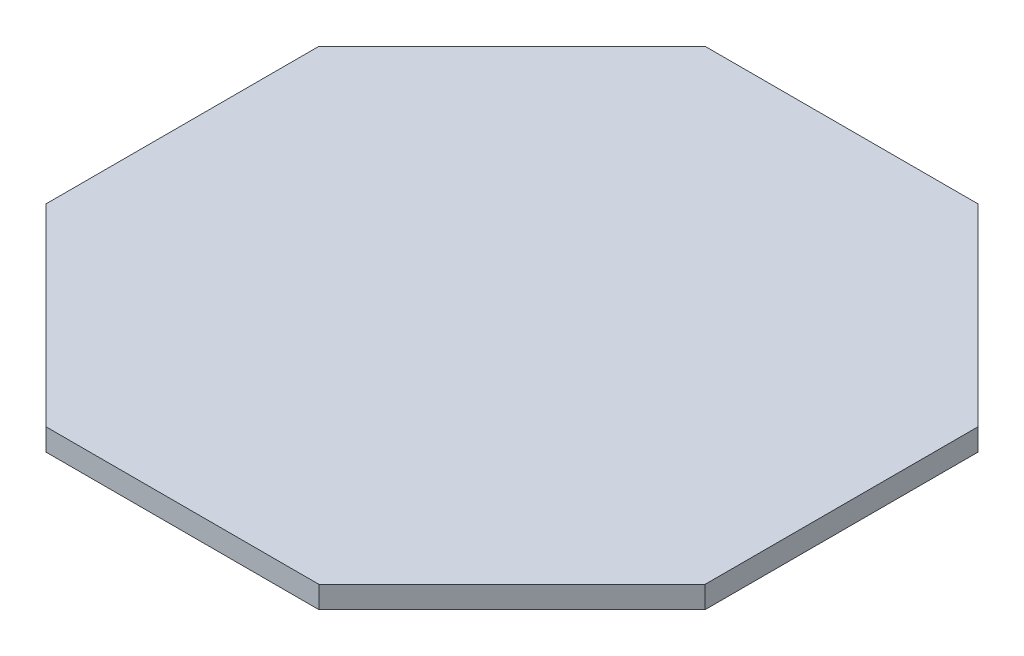
ISO-10303-21;
HEADER;
FILE_DESCRIPTION(('STEP AP214'),'2;1');
FILE_NAME('part.step','',(''),(''),'','','');
FILE_SCHEMA(('AUTOMOTIVE_DESIGN { 1 0 10303 214 1 1 1 1 }'));
ENDSEC;
DATA;
#1=APPLICATION_CONTEXT('core data for automotive mechanical design processes');
#2=APPLICATION_PROTOCOL_DEFINITION('international standard','automotive_design',2000,#1);
#3=PRODUCT_CONTEXT('',#1,'mechanical');
#4=PRODUCT('Part','Part','',(#3));
#5=PRODUCT_RELATED_PRODUCT_CATEGORY('part','',(#4));
#6=PRODUCT_DEFINITION_FORMATION('','',#4);
#7=PRODUCT_DEFINITION_CONTEXT('part definition',#1,'design');
#8=PRODUCT_DEFINITION('design','',#6,#7);
#9=PRODUCT_DEFINITION_SHAPE('','',#8);
#10=(LENGTH_UNIT() NAMED_UNIT(*) SI_UNIT(.MILLI.,.METRE.));
#11=(NAMED_UNIT(*) PLANE_ANGLE_UNIT() SI_UNIT($,.RADIAN.));
#12=(NAMED_UNIT(*) SI_UNIT($,.STERADIAN.) SOLID_ANGLE_UNIT());
#13=UNCERTAINTY_MEASURE_WITH_UNIT(LENGTH_MEASURE(1.E-05),#10,'distance_accuracy_value','');
#14=(GEOMETRIC_REPRESENTATION_CONTEXT(3) GLOBAL_UNCERTAINTY_ASSIGNED_CONTEXT((#13)) GLOBAL_UNIT_ASSIGNED_CONTEXT((#10,
#11,#12)) REPRESENTATION_CONTEXT('',''));
#15=CARTESIAN_POINT('',(0.,0.,0.));
#16=DIRECTION('',(0.,0.,1.));
#17=DIRECTION('',(1.,0.,0.));
#18=AXIS2_PLACEMENT_3D('',#15,#16,#17);
#19=CARTESIAN_POINT('',(62.1320343559642,10.,150.));
#20=DIRECTION('',(-0.707106781186548,0.,-0.707106781186548));
#21=DIRECTION('',(-0.707106781186548,0.,0.707106781186548));
#22=AXIS2_PLACEMENT_3D('',#19,#20,#21);
#23=PLANE('',#22);
#24=DIRECTION('',(0.707106781186547,0.,-0.707106781186547));
#25=VECTOR('',#24,1.);
#26=CARTESIAN_POINT('',(62.1320343559642,0.,150.));
#27=LINE('',#26,#25);
#28=CARTESIAN_POINT('',(62.1320343559642,0.,150.));
#29=VERTEX_POINT('',#28);
#30=CARTESIAN_POINT('',(150.,0.,62.1320343559642));
#31=VERTEX_POINT('',#30);
#32=EDGE_CURVE('E144',#29,#31,#27,.T.);
#33=ORIENTED_EDGE('',*,*,#32,.T.);
#34=DIRECTION('',(0.,-1.,0.));
#35=VECTOR('',#34,1.);
#36=CARTESIAN_POINT('',(150.,10.,62.1320343559642));
#37=LINE('',#36,#35);
#38=CARTESIAN_POINT('',(150.,10.,62.1320343559642));
#39=VERTEX_POINT('',#38);
#40=EDGE_CURVE('E11',#39,#31,#37,.T.);
#41=ORIENTED_EDGE('',*,*,#40,.F.);
#42=DIRECTION('',(0.707106781186547,0.,-0.707106781186547));
#43=VECTOR('',#42,1.);
#44=CARTESIAN_POINT('',(62.1320343559642,10.,150.));
#45=LINE('',#44,#43);
#46=CARTESIAN_POINT('',(62.1320343559642,10.,150.));
#47=VERTEX_POINT('',#46);
#48=EDGE_CURVE('E166',#47,#39,#45,.T.);
#49=ORIENTED_EDGE('',*,*,#48,.F.);
#50=DIRECTION('',(0.,-1.,0.));
#51=VECTOR('',#50,1.);
#52=CARTESIAN_POINT('',(62.1320343559642,10.,150.));
#53=LINE('',#52,#51);
#54=EDGE_CURVE('E140',#47,#29,#53,.T.);
#55=ORIENTED_EDGE('',*,*,#54,.T.);
#56=EDGE_LOOP('',(#33,#41,#49,#55));
#57=FACE_BOUND('',#56,.T.);
#58=ADVANCED_FACE('F43',(#57),#23,.F.);
#59=CARTESIAN_POINT('',(150.,10.,62.1320343559642));
#60=DIRECTION('',(-1.,0.,0.));
#61=DIRECTION('',(0.,0.,1.));
#62=AXIS2_PLACEMENT_3D('',#59,#60,#61);
#63=PLANE('',#62);
#64=DIRECTION('',(0.,0.,-1.));
#65=VECTOR('',#64,1.);
#66=CARTESIAN_POINT('',(150.,0.,62.1320343559642));
#67=LINE('',#66,#65);
#68=CARTESIAN_POINT('',(150.,0.,-62.1320343559642));
#69=VERTEX_POINT('',#68);
#70=EDGE_CURVE('E148',#31,#69,#67,.T.);
#71=ORIENTED_EDGE('',*,*,#70,.T.);
#72=DIRECTION('',(0.,-1.,0.));
#73=VECTOR('',#72,1.);
#74=CARTESIAN_POINT('',(150.,10.,-62.1320343559642));
#75=LINE('',#74,#73);
#76=CARTESIAN_POINT('',(150.,10.,-62.1320343559642));
#77=VERTEX_POINT('',#76);
#78=EDGE_CURVE('E52',#77,#69,#75,.T.);
#79=ORIENTED_EDGE('',*,*,#78,.F.);
#80=DIRECTION('',(0.,0.,-1.));
#81=VECTOR('',#80,1.);
#82=CARTESIAN_POINT('',(150.,10.,62.1320343559642));
#83=LINE('',#82,#81);
#84=EDGE_CURVE('E103',#39,#77,#83,.T.);
#85=ORIENTED_EDGE('',*,*,#84,.F.);
#86=ORIENTED_EDGE('',*,*,#40,.T.);
#87=EDGE_LOOP('',(#71,#79,#85,#86));
#88=FACE_BOUND('',#87,.T.);
#89=ADVANCED_FACE('F212',(#88),#63,.F.);
#90=CARTESIAN_POINT('',(150.,10.,-62.1320343559642));
#91=DIRECTION('',(-0.707106781186547,0.,0.707106781186548));
#92=DIRECTION('',(0.707106781186548,0.,0.707106781186547));
#93=AXIS2_PLACEMENT_3D('',#90,#91,#92);
#94=PLANE('',#93);
#95=DIRECTION('',(-0.707106781186548,0.,-0.707106781186547));
#96=VECTOR('',#95,1.);
#97=CARTESIAN_POINT('',(150.,0.,-62.1320343559642));
#98=LINE('',#97,#96);
#99=CARTESIAN_POINT('',(62.1320343559642,0.,-150.));
#100=VERTEX_POINT('',#99);
#101=EDGE_CURVE('E151',#69,#100,#98,.T.);
#102=ORIENTED_EDGE('',*,*,#101,.T.);
#103=DIRECTION('',(0.,-1.,0.));
#104=VECTOR('',#103,1.);
#105=CARTESIAN_POINT('',(62.1320343559642,10.,-150.));
#106=LINE('',#105,#104);
#107=CARTESIAN_POINT('',(62.1320343559642,10.,-150.));
#108=VERTEX_POINT('',#107);
#109=EDGE_CURVE('E177',#108,#100,#106,.T.);
#110=ORIENTED_EDGE('',*,*,#109,.F.);
#111=DIRECTION('',(-0.707106781186548,0.,-0.707106781186547));
#112=VECTOR('',#111,1.);
#113=CARTESIAN_POINT('',(150.,10.,-62.1320343559642));
#114=LINE('',#113,#112);
#115=EDGE_CURVE('E187',#77,#108,#114,.T.);
#116=ORIENTED_EDGE('',*,*,#115,.F.);
#117=ORIENTED_EDGE('',*,*,#78,.T.);
#118=EDGE_LOOP('',(#102,#110,#116,#117));
#119=FACE_BOUND('',#118,.T.);
#120=ADVANCED_FACE('F185',(#119),#94,.F.);
#121=CARTESIAN_POINT('',(62.1320343559642,10.,-150.));
#122=DIRECTION('',(0.,0.,1.));
#123=DIRECTION('',(1.,0.,0.));
#124=AXIS2_PLACEMENT_3D('',#121,#122,#123);
#125=PLANE('',#124);
#126=DIRECTION('',(-1.,0.,0.));
#127=VECTOR('',#126,1.);
#128=CARTESIAN_POINT('',(62.1320343559642,0.,-150.));
#129=LINE('',#128,#127);
#130=CARTESIAN_POINT('',(-62.1320343559642,0.,-150.));
#131=VERTEX_POINT('',#130);
#132=EDGE_CURVE('E154',#100,#131,#129,.T.);
#133=ORIENTED_EDGE('',*,*,#132,.T.);
#134=DIRECTION('',(0.,-1.,0.));
#135=VECTOR('',#134,1.);
#136=CARTESIAN_POINT('',(-62.1320343559642,10.,-150.));
#137=LINE('',#136,#135);
#138=CARTESIAN_POINT('',(-62.1320343559642,10.,-150.));
#139=VERTEX_POINT('',#138);
#140=EDGE_CURVE('E173',#139,#131,#137,.T.);
#141=ORIENTED_EDGE('',*,*,#140,.F.);
#142=DIRECTION('',(-1.,0.,0.));
#143=VECTOR('',#142,1.);
#144=CARTESIAN_POINT('',(62.1320343559642,10.,-150.));
#145=LINE('',#144,#143);
#146=EDGE_CURVE('E200',#108,#139,#145,.T.);
#147=ORIENTED_EDGE('',*,*,#146,.F.);
#148=ORIENTED_EDGE('',*,*,#109,.T.);
#149=EDGE_LOOP('',(#133,#141,#147,#148));
#150=FACE_BOUND('',#149,.T.);
#151=ADVANCED_FACE('F195',(#150),#125,.F.);
#152=CARTESIAN_POINT('',(-62.1320343559642,10.,-150.));
#153=DIRECTION('',(0.707106781186547,0.,0.707106781186548));
#154=DIRECTION('',(0.707106781186548,0.,-0.707106781186547));
#155=AXIS2_PLACEMENT_3D('',#152,#153,#154);
#156=PLANE('',#155);
#157=DIRECTION('',(-0.707106781186548,0.,0.707106781186547));
#158=VECTOR('',#157,1.);
#159=CARTESIAN_POINT('',(-62.1320343559642,0.,-150.));
#160=LINE('',#159,#158);
#161=CARTESIAN_POINT('',(-150.,0.,-62.1320343559641));
#162=VERTEX_POINT('',#161);
#163=EDGE_CURVE('E157',#131,#162,#160,.T.);
#164=ORIENTED_EDGE('',*,*,#163,.T.);
#165=DIRECTION('',(0.,-1.,0.));
#166=VECTOR('',#165,1.);
#167=CARTESIAN_POINT('',(-150.,10.,-62.1320343559641));
#168=LINE('',#167,#166);
#169=CARTESIAN_POINT('',(-150.,10.,-62.1320343559641));
#170=VERTEX_POINT('',#169);
#171=EDGE_CURVE('E133',#170,#162,#168,.T.);
#172=ORIENTED_EDGE('',*,*,#171,.F.);
#173=DIRECTION('',(-0.707106781186548,0.,0.707106781186547));
#174=VECTOR('',#173,1.);
#175=CARTESIAN_POINT('',(-62.1320343559642,10.,-150.));
#176=LINE('',#175,#174);
#177=EDGE_CURVE('E122',#139,#170,#176,.T.);
#178=ORIENTED_EDGE('',*,*,#177,.F.);
#179=ORIENTED_EDGE('',*,*,#140,.T.);
#180=EDGE_LOOP('',(#164,#172,#178,#179));
#181=FACE_BOUND('',#180,.T.);
#182=ADVANCED_FACE('F198',(#181),#156,.F.);
#183=CARTESIAN_POINT('',(-150.,10.,-62.1320343559641));
#184=DIRECTION('',(1.,0.,0.));
#185=DIRECTION('',(0.,0.,-1.));
#186=AXIS2_PLACEMENT_3D('',#183,#184,#185);
#187=PLANE('',#186);
#188=DIRECTION('',(0.,0.,1.));
#189=VECTOR('',#188,1.);
#190=CARTESIAN_POINT('',(-150.,0.,-62.1320343559641));
#191=LINE('',#190,#189);
#192=CARTESIAN_POINT('',(-150.,0.,62.1320343559643));
#193=VERTEX_POINT('',#192);
#194=EDGE_CURVE('E131',#162,#193,#191,.T.);
#195=ORIENTED_EDGE('',*,*,#194,.T.);
#196=DIRECTION('',(0.,-1.,0.));
#197=VECTOR('',#196,1.);
#198=CARTESIAN_POINT('',(-150.,10.,62.1320343559643));
#199=LINE('',#198,#197);
#200=CARTESIAN_POINT('',(-150.,10.,62.1320343559643));
#201=VERTEX_POINT('',#200);
#202=EDGE_CURVE('E128',#201,#193,#199,.T.);
#203=ORIENTED_EDGE('',*,*,#202,.F.);
#204=DIRECTION('',(0.,0.,1.));
#205=VECTOR('',#204,1.);
#206=CARTESIAN_POINT('',(-150.,10.,-62.1320343559641));
#207=LINE('',#206,#205);
#208=EDGE_CURVE('E116',#170,#201,#207,.T.);
#209=ORIENTED_EDGE('',*,*,#208,.F.);
#210=ORIENTED_EDGE('',*,*,#171,.T.);
#211=EDGE_LOOP('',(#195,#203,#209,#210));
#212=FACE_BOUND('',#211,.T.);
#213=ADVANCED_FACE('F129',(#212),#187,.F.);
#214=CARTESIAN_POINT('',(-150.,10.,62.1320343559643));
#215=DIRECTION('',(0.707106781186547,0.,-0.707106781186548));
#216=DIRECTION('',(-0.707106781186548,0.,-0.707106781186547));
#217=AXIS2_PLACEMENT_3D('',#214,#215,#216);
#218=PLANE('',#217);
#219=DIRECTION('',(0.707106781186548,0.,0.707106781186547));
#220=VECTOR('',#219,1.);
#221=CARTESIAN_POINT('',(-150.,0.,62.1320343559643));
#222=LINE('',#221,#220);
#223=CARTESIAN_POINT('',(-62.1320343559643,0.,150.));
#224=VERTEX_POINT('',#223);
#225=EDGE_CURVE('E89',#193,#224,#222,.T.);
#226=ORIENTED_EDGE('',*,*,#225,.T.);
#227=DIRECTION('',(0.,-1.,0.));
#228=VECTOR('',#227,1.);
#229=CARTESIAN_POINT('',(-62.1320343559643,10.,150.));
#230=LINE('',#229,#228);
#231=CARTESIAN_POINT('',(-62.1320343559643,10.,150.));
#232=VERTEX_POINT('',#231);
#233=EDGE_CURVE('E134',#232,#224,#230,.T.);
#234=ORIENTED_EDGE('',*,*,#233,.F.);
#235=DIRECTION('',(0.707106781186548,0.,0.707106781186547));
#236=VECTOR('',#235,1.);
#237=CARTESIAN_POINT('',(-150.,10.,62.1320343559643));
#238=LINE('',#237,#236);
#239=EDGE_CURVE('E120',#201,#232,#238,.T.);
#240=ORIENTED_EDGE('',*,*,#239,.F.);
#241=ORIENTED_EDGE('',*,*,#202,.T.);
#242=EDGE_LOOP('',(#226,#234,#240,#241));
#243=FACE_BOUND('',#242,.T.);
#244=ADVANCED_FACE('F136',(#243),#218,.F.);
#245=CARTESIAN_POINT('',(-62.1320343559643,10.,150.));
#246=DIRECTION('',(0.,0.,-1.));
#247=DIRECTION('',(-1.,0.,0.));
#248=AXIS2_PLACEMENT_3D('',#245,#246,#247);
#249=PLANE('',#248);
#250=DIRECTION('',(1.,0.,0.));
#251=VECTOR('',#250,1.);
#252=CARTESIAN_POINT('',(-62.1320343559643,0.,150.));
#253=LINE('',#252,#251);
#254=EDGE_CURVE('E95',#224,#29,#253,.T.);
#255=ORIENTED_EDGE('',*,*,#254,.T.);
#256=ORIENTED_EDGE('',*,*,#54,.F.);
#257=DIRECTION('',(1.,0.,0.));
#258=VECTOR('',#257,1.);
#259=CARTESIAN_POINT('',(-62.1320343559643,10.,150.));
#260=LINE('',#259,#258);
#261=EDGE_CURVE('E60',#232,#47,#260,.T.);
#262=ORIENTED_EDGE('',*,*,#261,.F.);
#263=ORIENTED_EDGE('',*,*,#233,.T.);
#264=EDGE_LOOP('',(#255,#256,#262,#263));
#265=FACE_BOUND('',#264,.T.);
#266=ADVANCED_FACE('F228',(#265),#249,.F.);
#267=CARTESIAN_POINT('',(0.,10.,0.));
#268=DIRECTION('',(0.,1.,0.));
#269=DIRECTION('',(0.,0.,1.));
#270=AXIS2_PLACEMENT_3D('',#267,#268,#269);
#271=PLANE('',#270);
#272=ORIENTED_EDGE('',*,*,#48,.T.);
#273=ORIENTED_EDGE('',*,*,#84,.T.);
#274=ORIENTED_EDGE('',*,*,#115,.T.);
#275=ORIENTED_EDGE('',*,*,#146,.T.);
#276=ORIENTED_EDGE('',*,*,#177,.T.);
#277=ORIENTED_EDGE('',*,*,#208,.T.);
#278=ORIENTED_EDGE('',*,*,#239,.T.);
#279=ORIENTED_EDGE('',*,*,#261,.T.);
#280=EDGE_LOOP('',(#272,#273,#274,#275,#276,#277,#278,#279));
#281=FACE_BOUND('',#280,.T.);
#282=ADVANCED_FACE('F118',(#281),#271,.T.);
#283=CARTESIAN_POINT('',(0.,0.,0.));
#284=DIRECTION('',(0.,1.,0.));
#285=DIRECTION('',(0.,0.,1.));
#286=AXIS2_PLACEMENT_3D('',#283,#284,#285);
#287=PLANE('',#286);
#288=ORIENTED_EDGE('',*,*,#32,.F.);
#289=ORIENTED_EDGE('',*,*,#254,.F.);
#290=ORIENTED_EDGE('',*,*,#225,.F.);
#291=ORIENTED_EDGE('',*,*,#194,.F.);
#292=ORIENTED_EDGE('',*,*,#163,.F.);
#293=ORIENTED_EDGE('',*,*,#132,.F.);
#294=ORIENTED_EDGE('',*,*,#101,.F.);
#295=ORIENTED_EDGE('',*,*,#70,.F.);
#296=EDGE_LOOP('',(#288,#289,#290,#291,#292,#293,#294,#295));
#297=FACE_BOUND('',#296,.T.);
#298=ADVANCED_FACE('F191',(#297),#287,.F.);
#299=CLOSED_SHELL('',(#58,#89,#120,#151,#182,#213,#244,#266,#282,#298));
#300=MANIFOLD_SOLID_BREP('B2',#299);
#301=ADVANCED_BREP_SHAPE_REPRESENTATION('',(#18,#300),#14);
#302=SHAPE_DEFINITION_REPRESENTATION(#9,#301);
ENDSEC;
END-ISO-10303-21;
